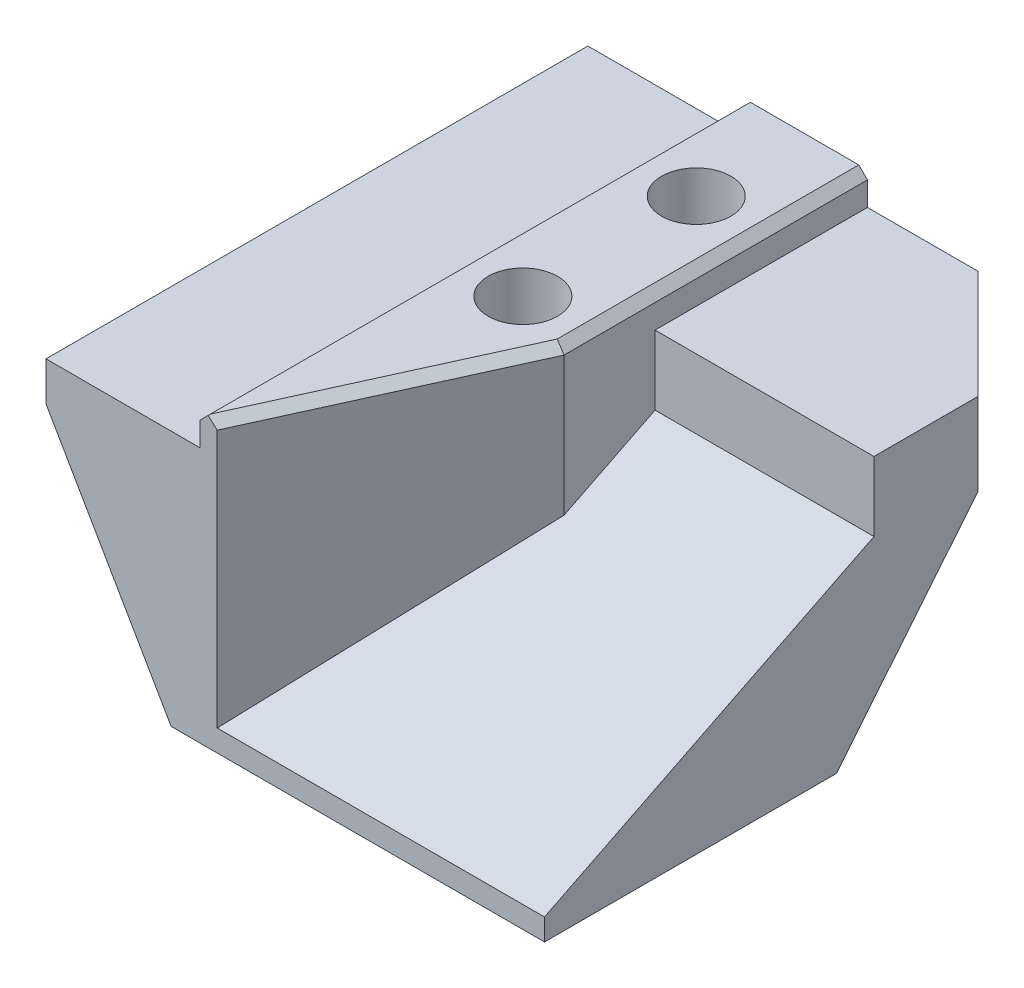
ISO-10303-21;
HEADER;
FILE_DESCRIPTION(('STEP AP214'),'2;1');
FILE_NAME('part.step','',(''),(''),'','','');
FILE_SCHEMA(('AUTOMOTIVE_DESIGN { 1 0 10303 214 1 1 1 1 }'));
ENDSEC;
DATA;
#1=APPLICATION_CONTEXT('core data for automotive mechanical design processes');
#2=APPLICATION_PROTOCOL_DEFINITION('international standard','automotive_design',2000,#1);
#3=PRODUCT_CONTEXT('',#1,'mechanical');
#4=PRODUCT('Part','Part','',(#3));
#5=PRODUCT_RELATED_PRODUCT_CATEGORY('part','',(#4));
#6=PRODUCT_DEFINITION_FORMATION('','',#4);
#7=PRODUCT_DEFINITION_CONTEXT('part definition',#1,'design');
#8=PRODUCT_DEFINITION('design','',#6,#7);
#9=PRODUCT_DEFINITION_SHAPE('','',#8);
#10=(LENGTH_UNIT() NAMED_UNIT(*) SI_UNIT(.MILLI.,.METRE.));
#11=(NAMED_UNIT(*) PLANE_ANGLE_UNIT() SI_UNIT($,.RADIAN.));
#12=(NAMED_UNIT(*) SI_UNIT($,.STERADIAN.) SOLID_ANGLE_UNIT());
#13=UNCERTAINTY_MEASURE_WITH_UNIT(LENGTH_MEASURE(1.E-05),#10,'distance_accuracy_value','');
#14=(GEOMETRIC_REPRESENTATION_CONTEXT(3) GLOBAL_UNCERTAINTY_ASSIGNED_CONTEXT((#13)) GLOBAL_UNIT_ASSIGNED_CONTEXT((#10,
#11,#12)) REPRESENTATION_CONTEXT('',''));
#15=CARTESIAN_POINT('',(0.,0.,0.));
#16=DIRECTION('',(0.,0.,1.));
#17=DIRECTION('',(1.,0.,0.));
#18=AXIS2_PLACEMENT_3D('',#15,#16,#17);
#19=CARTESIAN_POINT('',(12.9,7.8,20.));
#20=DIRECTION('',(-1.,0.,0.));
#21=DIRECTION('',(0.,0.,-1.));
#22=AXIS2_PLACEMENT_3D('',#19,#20,#21);
#23=PLANE('',#22);
#24=DIRECTION('',(0.,-1.,0.));
#25=VECTOR('',#24,1.);
#26=CARTESIAN_POINT('',(12.9,0.,9.8));
#27=LINE('',#26,#25);
#28=CARTESIAN_POINT('',(12.9,7.8,9.8));
#29=VERTEX_POINT('',#28);
#30=CARTESIAN_POINT('',(12.9,4.6,9.8));
#31=VERTEX_POINT('',#30);
#32=EDGE_CURVE('E171',#29,#31,#27,.T.);
#33=ORIENTED_EDGE('',*,*,#32,.F.);
#34=DIRECTION('',(0.,0.,-1.));
#35=VECTOR('',#34,1.);
#36=CARTESIAN_POINT('',(12.9,7.8,7.));
#37=LINE('',#36,#35);
#38=CARTESIAN_POINT('',(12.9,7.8,0.));
#39=VERTEX_POINT('',#38);
#40=EDGE_CURVE('E194',#29,#39,#37,.T.);
#41=ORIENTED_EDGE('',*,*,#40,.T.);
#42=DIRECTION('',(0.,-1.,0.));
#43=VECTOR('',#42,1.);
#44=CARTESIAN_POINT('',(12.9,7.8,0.));
#45=LINE('',#44,#43);
#46=CARTESIAN_POINT('',(12.9,8.9,0.));
#47=VERTEX_POINT('',#46);
#48=EDGE_CURVE('E252',#47,#39,#45,.T.);
#49=ORIENTED_EDGE('',*,*,#48,.F.);
#50=DIRECTION('',(0.,0.,-1.));
#51=VECTOR('',#50,1.);
#52=CARTESIAN_POINT('',(12.9,8.9,0.));
#53=LINE('',#52,#51);
#54=CARTESIAN_POINT('',(12.9,8.9,14.));
#55=VERTEX_POINT('',#54);
#56=EDGE_CURVE('E313',#55,#47,#53,.T.);
#57=ORIENTED_EDGE('',*,*,#56,.F.);
#58=DIRECTION('',(0.,1.,0.));
#59=VECTOR('',#58,1.);
#60=CARTESIAN_POINT('',(12.9,-13.0461510298504,14.));
#61=LINE('',#60,#59);
#62=CARTESIAN_POINT('',(12.9,2.5,14.));
#63=VERTEX_POINT('',#62);
#64=EDGE_CURVE('E179',#63,#55,#61,.T.);
#65=ORIENTED_EDGE('',*,*,#64,.F.);
#66=DIRECTION('',(0.,-0.447213595499958,0.894427190999916));
#67=VECTOR('',#66,1.);
#68=CARTESIAN_POINT('',(12.9,6.,7.));
#69=LINE('',#68,#67);
#70=EDGE_CURVE('E163',#31,#63,#69,.T.);
#71=ORIENTED_EDGE('',*,*,#70,.F.);
#72=EDGE_LOOP('',(#33,#41,#49,#57,#65,#71));
#73=FACE_BOUND('',#72,.T.);
#74=ADVANCED_FACE('F39',(#73),#23,.F.);
#75=CARTESIAN_POINT('',(-7.2246117974981,6.,7.));
#76=DIRECTION('',(0.,-0.894427190999916,-0.447213595499958));
#77=DIRECTION('',(0.,-0.447213595499958,0.894427190999916));
#78=AXIS2_PLACEMENT_3D('',#75,#76,#77);
#79=PLANE('',#78);
#80=DIRECTION('',(1.,0.,0.));
#81=VECTOR('',#80,1.);
#82=CARTESIAN_POINT('',(8.64794167490615,4.6,9.8));
#83=LINE('',#82,#81);
#84=CARTESIAN_POINT('',(23.,4.6,9.8));
#85=VERTEX_POINT('',#84);
#86=EDGE_CURVE('E159',#31,#85,#83,.T.);
#87=ORIENTED_EDGE('',*,*,#86,.F.);
#88=ORIENTED_EDGE('',*,*,#70,.T.);
#89=DIRECTION('',(0.376621788577355,0.41428396743509,-0.82856793487018));
#90=VECTOR('',#89,1.);
#91=CARTESIAN_POINT('',(10.4743594137822,-0.168204644839576,19.3364092896792));
#92=LINE('',#91,#90);
#93=CARTESIAN_POINT('',(7.9,-3.,25.));
#94=VERTEX_POINT('',#93);
#95=EDGE_CURVE('E200',#94,#63,#92,.T.);
#96=ORIENTED_EDGE('',*,*,#95,.F.);
#97=DIRECTION('',(1.,0.,0.));
#98=VECTOR('',#97,1.);
#99=CARTESIAN_POINT('',(-7.2246117974981,-3.,25.));
#100=LINE('',#99,#98);
#101=CARTESIAN_POINT('',(23.,-3.,25.));
#102=VERTEX_POINT('',#101);
#103=EDGE_CURVE('E180',#94,#102,#100,.T.);
#104=ORIENTED_EDGE('',*,*,#103,.T.);
#105=DIRECTION('',(0.,-0.447213595499958,0.894427190999916));
#106=VECTOR('',#105,1.);
#107=CARTESIAN_POINT('',(23.,6.,7.));
#108=LINE('',#107,#106);
#109=EDGE_CURVE('E167',#85,#102,#108,.T.);
#110=ORIENTED_EDGE('',*,*,#109,.F.);
#111=EDGE_LOOP('',(#87,#88,#96,#104,#110));
#112=FACE_BOUND('',#111,.T.);
#113=ADVANCED_FACE('F161',(#112),#79,.F.);
#114=CARTESIAN_POINT('',(10.,7.8,13.));
#115=DIRECTION('',(0.,-1.,0.));
#116=DIRECTION('',(0.,0.,1.));
#117=AXIS2_PLACEMENT_3D('',#114,#115,#116);
#118=CYLINDRICAL_SURFACE('',#117,1.6);
#119=CARTESIAN_POINT('',(10.,3.90000000000001,13.));
#120=DIRECTION('',(0.,1.,0.));
#121=DIRECTION('',(0.,0.,1.));
#122=AXIS2_PLACEMENT_3D('',#119,#120,#121);
#123=CIRCLE('',#122,1.6);
#124=CARTESIAN_POINT('',(10.,3.90000000000001,14.6));
#125=VERTEX_POINT('',#124);
#126=EDGE_CURVE('E284',#125,#125,#123,.T.);
#127=ORIENTED_EDGE('',*,*,#126,.F.);
#128=EDGE_LOOP('',(#127));
#129=FACE_BOUND('',#128,.T.);
#130=CARTESIAN_POINT('',(10.,9.3,13.));
#131=DIRECTION('',(0.,-1.,0.));
#132=DIRECTION('',(0.,0.,-1.));
#133=AXIS2_PLACEMENT_3D('',#130,#131,#132);
#134=CIRCLE('',#133,1.6);
#135=CARTESIAN_POINT('',(10.,9.3,11.4));
#136=VERTEX_POINT('',#135);
#137=EDGE_CURVE('E237',#136,#136,#134,.T.);
#138=ORIENTED_EDGE('',*,*,#137,.F.);
#139=EDGE_LOOP('',(#138));
#140=FACE_BOUND('',#139,.T.);
#141=ADVANCED_FACE('F371',(#129,#140),#118,.F.);
#142=CARTESIAN_POINT('',(10.,7.8,5.));
#143=DIRECTION('',(0.,-1.,0.));
#144=DIRECTION('',(0.,0.,1.));
#145=AXIS2_PLACEMENT_3D('',#142,#143,#144);
#146=CYLINDRICAL_SURFACE('',#145,1.6);
#147=CARTESIAN_POINT('',(10.,3.90000000000001,5.));
#148=DIRECTION('',(0.,1.,0.));
#149=DIRECTION('',(0.,0.,1.));
#150=AXIS2_PLACEMENT_3D('',#147,#148,#149);
#151=CIRCLE('',#150,1.6);
#152=CARTESIAN_POINT('',(10.,3.90000000000001,6.6));
#153=VERTEX_POINT('',#152);
#154=EDGE_CURVE('E287',#153,#153,#151,.T.);
#155=ORIENTED_EDGE('',*,*,#154,.F.);
#156=EDGE_LOOP('',(#155));
#157=FACE_BOUND('',#156,.T.);
#158=CARTESIAN_POINT('',(10.,9.3,5.));
#159=DIRECTION('',(0.,-1.,0.));
#160=DIRECTION('',(0.,0.,-1.));
#161=AXIS2_PLACEMENT_3D('',#158,#159,#160);
#162=CIRCLE('',#161,1.6);
#163=CARTESIAN_POINT('',(10.,9.3,3.4));
#164=VERTEX_POINT('',#163);
#165=EDGE_CURVE('E234',#164,#164,#162,.T.);
#166=ORIENTED_EDGE('',*,*,#165,.F.);
#167=EDGE_LOOP('',(#166));
#168=FACE_BOUND('',#167,.T.);
#169=ADVANCED_FACE('F380',(#157,#168),#146,.F.);
#170=CARTESIAN_POINT('',(0.,4.,0.));
#171=DIRECTION('',(1.,0.,0.));
#172=DIRECTION('',(0.,0.,1.));
#173=AXIS2_PLACEMENT_3D('',#170,#171,#172);
#174=PLANE('',#173);
#175=DIRECTION('',(0.,1.,0.));
#176=VECTOR('',#175,1.);
#177=CARTESIAN_POINT('',(0.,-4.,25.));
#178=LINE('',#177,#176);
#179=CARTESIAN_POINT('',(0.,6.00000000000006,25.));
#180=VERTEX_POINT('',#179);
#181=CARTESIAN_POINT('',(0.,7.8,25.));
#182=VERTEX_POINT('',#181);
#183=EDGE_CURVE('E214',#180,#182,#178,.T.);
#184=ORIENTED_EDGE('',*,*,#183,.T.);
#185=DIRECTION('',(0.,0.,-1.));
#186=VECTOR('',#185,1.);
#187=CARTESIAN_POINT('',(0.,7.8,20.));
#188=LINE('',#187,#186);
#189=CARTESIAN_POINT('',(0.,7.8,0.));
#190=VERTEX_POINT('',#189);
#191=EDGE_CURVE('E246',#182,#190,#188,.T.);
#192=ORIENTED_EDGE('',*,*,#191,.T.);
#193=DIRECTION('',(0.,-1.,0.));
#194=VECTOR('',#193,1.);
#195=CARTESIAN_POINT('',(0.,4.,0.));
#196=LINE('',#195,#194);
#197=CARTESIAN_POINT('',(0.,6.00000000000006,0.));
#198=VERTEX_POINT('',#197);
#199=EDGE_CURVE('E254',#190,#198,#196,.T.);
#200=ORIENTED_EDGE('',*,*,#199,.T.);
#201=DIRECTION('',(0.,0.,-1.));
#202=VECTOR('',#201,1.);
#203=CARTESIAN_POINT('',(0.,6.00000000000006,0.));
#204=LINE('',#203,#202);
#205=EDGE_CURVE('E262',#180,#198,#204,.T.);
#206=ORIENTED_EDGE('',*,*,#205,.F.);
#207=EDGE_LOOP('',(#184,#192,#200,#206));
#208=FACE_BOUND('',#207,.T.);
#209=ADVANCED_FACE('F342',(#208),#174,.F.);
#210=CARTESIAN_POINT('',(0.,4.,0.));
#211=DIRECTION('',(0.,0.,1.));
#212=DIRECTION('',(-1.,0.,0.));
#213=AXIS2_PLACEMENT_3D('',#210,#211,#212);
#214=PLANE('',#213);
#215=ORIENTED_EDGE('',*,*,#48,.T.);
#216=DIRECTION('',(1.,0.,0.));
#217=VECTOR('',#216,1.);
#218=CARTESIAN_POINT('',(12.9,7.8,0.));
#219=LINE('',#218,#217);
#220=CARTESIAN_POINT('',(18.,7.8,0.));
#221=VERTEX_POINT('',#220);
#222=EDGE_CURVE('E196',#39,#221,#219,.T.);
#223=ORIENTED_EDGE('',*,*,#222,.T.);
#224=DIRECTION('',(0.,1.,0.));
#225=VECTOR('',#224,1.);
#226=CARTESIAN_POINT('',(18.,6.,0.));
#227=LINE('',#226,#225);
#228=CARTESIAN_POINT('',(18.,4.00000000000006,0.));
#229=VERTEX_POINT('',#228);
#230=EDGE_CURVE('E271',#229,#221,#227,.T.);
#231=ORIENTED_EDGE('',*,*,#230,.F.);
#232=DIRECTION('',(-0.632455532033675,-0.774596669241484,0.));
#233=VECTOR('',#232,1.);
#234=CARTESIAN_POINT('',(9.17442188206252,-6.80908153700972,0.));
#235=LINE('',#234,#233);
#236=CARTESIAN_POINT('',(11.4680273525781,-4.,0.));
#237=VERTEX_POINT('',#236);
#238=EDGE_CURVE('E276',#237,#229,#235,.F.);
#239=ORIENTED_EDGE('',*,*,#238,.F.);
#240=DIRECTION('',(-1.,0.,0.));
#241=VECTOR('',#240,1.);
#242=CARTESIAN_POINT('',(23.,-4.,0.));
#243=LINE('',#242,#241);
#244=CARTESIAN_POINT('',(5.77350269189626,-4.,0.));
#245=VERTEX_POINT('',#244);
#246=EDGE_CURVE('E231',#237,#245,#243,.T.);
#247=ORIENTED_EDGE('',*,*,#246,.T.);
#248=DIRECTION('',(0.499999999999998,-0.86602540378444,0.));
#249=VECTOR('',#248,1.);
#250=CARTESIAN_POINT('',(5.77350269189626,-4.,0.));
#251=LINE('',#250,#249);
#252=EDGE_CURVE('E265',#198,#245,#251,.T.);
#253=ORIENTED_EDGE('',*,*,#252,.F.);
#254=ORIENTED_EDGE('',*,*,#199,.F.);
#255=DIRECTION('',(1.,0.,0.));
#256=VECTOR('',#255,1.);
#257=CARTESIAN_POINT('',(0.,7.8,0.));
#258=LINE('',#257,#256);
#259=CARTESIAN_POINT('',(7.1,7.8,0.));
#260=VERTEX_POINT('',#259);
#261=EDGE_CURVE('E249',#190,#260,#258,.T.);
#262=ORIENTED_EDGE('',*,*,#261,.T.);
#263=DIRECTION('',(0.,-1.,0.));
#264=VECTOR('',#263,1.);
#265=CARTESIAN_POINT('',(7.1,9.3,0.));
#266=LINE('',#265,#264);
#267=CARTESIAN_POINT('',(7.1,8.9,0.));
#268=VERTEX_POINT('',#267);
#269=EDGE_CURVE('E243',#268,#260,#266,.T.);
#270=ORIENTED_EDGE('',*,*,#269,.F.);
#271=DIRECTION('',(-0.707106781186548,-0.707106781186548,0.));
#272=VECTOR('',#271,1.);
#273=CARTESIAN_POINT('',(7.5,9.3,0.));
#274=LINE('',#273,#272);
#275=CARTESIAN_POINT('',(7.5,9.3,0.));
#276=VERTEX_POINT('',#275);
#277=EDGE_CURVE('E315',#276,#268,#274,.T.);
#278=ORIENTED_EDGE('',*,*,#277,.F.);
#279=DIRECTION('',(1.,0.,0.));
#280=VECTOR('',#279,1.);
#281=CARTESIAN_POINT('',(7.1,9.3,0.));
#282=LINE('',#281,#280);
#283=CARTESIAN_POINT('',(12.5,9.3,0.));
#284=VERTEX_POINT('',#283);
#285=EDGE_CURVE('E241',#276,#284,#282,.T.);
#286=ORIENTED_EDGE('',*,*,#285,.T.);
#287=DIRECTION('',(-0.707106781186548,0.707106781186548,0.));
#288=VECTOR('',#287,1.);
#289=CARTESIAN_POINT('',(12.5,9.3,0.));
#290=LINE('',#289,#288);
#291=EDGE_CURVE('E48',#47,#284,#290,.T.);
#292=ORIENTED_EDGE('',*,*,#291,.F.);
#293=EDGE_LOOP('',(#215,#223,#231,#239,#247,#253,#254,#262,#270,#278,#286,#292));
#294=FACE_BOUND('',#293,.T.);
#295=ADVANCED_FACE('F330',(#294),#214,.F.);
#296=CARTESIAN_POINT('',(0.,7.8,0.));
#297=DIRECTION('',(0.,1.,0.));
#298=DIRECTION('',(0.,0.,-1.));
#299=AXIS2_PLACEMENT_3D('',#296,#297,#298);
#300=PLANE('',#299);
#301=DIRECTION('',(0.,0.,-1.));
#302=VECTOR('',#301,1.);
#303=CARTESIAN_POINT('',(7.1,7.8,20.));
#304=LINE('',#303,#302);
#305=CARTESIAN_POINT('',(7.1,7.8,25.));
#306=VERTEX_POINT('',#305);
#307=EDGE_CURVE('E240',#306,#260,#304,.T.);
#308=ORIENTED_EDGE('',*,*,#307,.T.);
#309=ORIENTED_EDGE('',*,*,#261,.F.);
#310=ORIENTED_EDGE('',*,*,#191,.F.);
#311=DIRECTION('',(1.,0.,0.));
#312=VECTOR('',#311,1.);
#313=CARTESIAN_POINT('',(0.,7.8,25.));
#314=LINE('',#313,#312);
#315=EDGE_CURVE('E217',#182,#306,#314,.T.);
#316=ORIENTED_EDGE('',*,*,#315,.T.);
#317=EDGE_LOOP('',(#308,#309,#310,#316));
#318=FACE_BOUND('',#317,.T.);
#319=ADVANCED_FACE('F338',(#318),#300,.T.);
#320=CARTESIAN_POINT('',(0.,9.3,0.));
#321=DIRECTION('',(0.,1.,0.));
#322=DIRECTION('',(0.,0.,-1.));
#323=AXIS2_PLACEMENT_3D('',#320,#321,#322);
#324=PLANE('',#323);
#325=ORIENTED_EDGE('',*,*,#285,.F.);
#326=DIRECTION('',(0.,0.,-1.));
#327=VECTOR('',#326,1.);
#328=CARTESIAN_POINT('',(7.5,9.3,0.));
#329=LINE('',#328,#327);
#330=CARTESIAN_POINT('',(7.5,9.3,24.9133563221124));
#331=VERTEX_POINT('',#330);
#332=EDGE_CURVE('E299',#331,#276,#329,.T.);
#333=ORIENTED_EDGE('',*,*,#332,.F.);
#334=DIRECTION('',(-0.413802944301184,0.,0.910366477462605));
#335=VECTOR('',#334,1.);
#336=CARTESIAN_POINT('',(7.53585340901495,9.3,24.8344788222795));
#337=LINE('',#336,#335);
#338=CARTESIAN_POINT('',(12.5,9.3,13.9133563221124));
#339=VERTEX_POINT('',#338);
#340=EDGE_CURVE('E301',#339,#331,#337,.T.);
#341=ORIENTED_EDGE('',*,*,#340,.F.);
#342=DIRECTION('',(0.,0.,1.));
#343=VECTOR('',#342,1.);
#344=CARTESIAN_POINT('',(12.5,9.3,14.));
#345=LINE('',#344,#343);
#346=EDGE_CURVE('E304',#284,#339,#345,.T.);
#347=ORIENTED_EDGE('',*,*,#346,.F.);
#348=EDGE_LOOP('',(#325,#333,#341,#347));
#349=FACE_BOUND('',#348,.T.);
#350=ORIENTED_EDGE('',*,*,#137,.T.);
#351=EDGE_LOOP('',(#350));
#352=FACE_BOUND('',#351,.T.);
#353=ORIENTED_EDGE('',*,*,#165,.T.);
#354=EDGE_LOOP('',(#353));
#355=FACE_BOUND('',#354,.T.);
#356=ADVANCED_FACE('F326',(#349,#352,#355),#324,.T.);
#357=CARTESIAN_POINT('',(7.1,9.3,20.));
#358=DIRECTION('',(1.,0.,0.));
#359=DIRECTION('',(0.,0.,1.));
#360=AXIS2_PLACEMENT_3D('',#357,#358,#359);
#361=PLANE('',#360);
#362=ORIENTED_EDGE('',*,*,#269,.T.);
#363=ORIENTED_EDGE('',*,*,#307,.F.);
#364=DIRECTION('',(0.,1.,0.));
#365=VECTOR('',#364,1.);
#366=CARTESIAN_POINT('',(7.1,7.8,25.));
#367=LINE('',#366,#365);
#368=CARTESIAN_POINT('',(7.1,8.9,25.));
#369=VERTEX_POINT('',#368);
#370=EDGE_CURVE('E220',#306,#369,#367,.T.);
#371=ORIENTED_EDGE('',*,*,#370,.T.);
#372=DIRECTION('',(0.,0.,1.));
#373=VECTOR('',#372,1.);
#374=CARTESIAN_POINT('',(7.1,8.9,25.));
#375=LINE('',#374,#373);
#376=EDGE_CURVE('E11',#268,#369,#375,.T.);
#377=ORIENTED_EDGE('',*,*,#376,.F.);
#378=EDGE_LOOP('',(#362,#363,#371,#377));
#379=FACE_BOUND('',#378,.T.);
#380=ADVANCED_FACE('F332',(#379),#361,.F.);
#381=CARTESIAN_POINT('',(10.,2.4,5.));
#382=DIRECTION('',(0.,-1.,0.));
#383=DIRECTION('',(0.,0.,1.));
#384=AXIS2_PLACEMENT_3D('',#381,#382,#383);
#385=CYLINDRICAL_SURFACE('',#384,3.);
#386=CARTESIAN_POINT('',(10.,2.50000000000002,5.));
#387=DIRECTION('',(0.,1.,0.));
#388=DIRECTION('',(0.,0.,1.));
#389=AXIS2_PLACEMENT_3D('',#386,#387,#388);
#390=CIRCLE('',#389,3.);
#391=CARTESIAN_POINT('',(10.,2.50000000000002,8.));
#392=VERTEX_POINT('',#391);
#393=EDGE_CURVE('E293',#392,#392,#390,.F.);
#394=ORIENTED_EDGE('',*,*,#393,.F.);
#395=EDGE_LOOP('',(#394));
#396=FACE_BOUND('',#395,.T.);
#397=CARTESIAN_POINT('',(10.,-4.,5.));
#398=DIRECTION('',(0.,1.,0.));
#399=DIRECTION('',(0.,0.,1.));
#400=AXIS2_PLACEMENT_3D('',#397,#398,#399);
#401=CIRCLE('',#400,3.);
#402=CARTESIAN_POINT('',(10.,-4.,8.));
#403=VERTEX_POINT('',#402);
#404=EDGE_CURVE('E222',#403,#403,#401,.T.);
#405=ORIENTED_EDGE('',*,*,#404,.F.);
#406=EDGE_LOOP('',(#405));
#407=FACE_BOUND('',#406,.T.);
#408=ADVANCED_FACE('F403',(#396,#407),#385,.F.);
#409=CARTESIAN_POINT('',(10.,2.4,13.));
#410=DIRECTION('',(0.,-1.,0.));
#411=DIRECTION('',(0.,0.,1.));
#412=AXIS2_PLACEMENT_3D('',#409,#410,#411);
#413=CYLINDRICAL_SURFACE('',#412,3.);
#414=CARTESIAN_POINT('',(10.,2.50000000000002,13.));
#415=DIRECTION('',(0.,1.,0.));
#416=DIRECTION('',(0.,0.,1.));
#417=AXIS2_PLACEMENT_3D('',#414,#415,#416);
#418=CIRCLE('',#417,3.);
#419=CARTESIAN_POINT('',(10.,2.50000000000002,16.));
#420=VERTEX_POINT('',#419);
#421=EDGE_CURVE('E290',#420,#420,#418,.F.);
#422=ORIENTED_EDGE('',*,*,#421,.F.);
#423=EDGE_LOOP('',(#422));
#424=FACE_BOUND('',#423,.T.);
#425=CARTESIAN_POINT('',(10.,-4.,13.));
#426=DIRECTION('',(0.,1.,0.));
#427=DIRECTION('',(0.,0.,1.));
#428=AXIS2_PLACEMENT_3D('',#425,#426,#427);
#429=CIRCLE('',#428,3.);
#430=CARTESIAN_POINT('',(10.,-4.,16.));
#431=VERTEX_POINT('',#430);
#432=EDGE_CURVE('E225',#431,#431,#429,.T.);
#433=ORIENTED_EDGE('',*,*,#432,.F.);
#434=EDGE_LOOP('',(#433));
#435=FACE_BOUND('',#434,.T.);
#436=ADVANCED_FACE('F406',(#424,#435),#413,.F.);
#437=CARTESIAN_POINT('',(23.,0.,0.));
#438=DIRECTION('',(1.,0.,0.));
#439=DIRECTION('',(0.,0.,1.));
#440=AXIS2_PLACEMENT_3D('',#437,#438,#439);
#441=PLANE('',#440);
#442=ORIENTED_EDGE('',*,*,#109,.T.);
#443=DIRECTION('',(0.,-1.,0.));
#444=VECTOR('',#443,1.);
#445=CARTESIAN_POINT('',(23.,6.,25.));
#446=LINE('',#445,#444);
#447=CARTESIAN_POINT('',(23.,-4.,25.));
#448=VERTEX_POINT('',#447);
#449=EDGE_CURVE('E208',#102,#448,#446,.T.);
#450=ORIENTED_EDGE('',*,*,#449,.T.);
#451=DIRECTION('',(0.,0.,-1.));
#452=VECTOR('',#451,1.);
#453=CARTESIAN_POINT('',(23.,-4.,20.));
#454=LINE('',#453,#452);
#455=CARTESIAN_POINT('',(23.,-4.,11.5319726474218));
#456=VERTEX_POINT('',#455);
#457=EDGE_CURVE('E228',#448,#456,#454,.T.);
#458=ORIENTED_EDGE('',*,*,#457,.T.);
#459=DIRECTION('',(0.,0.774596669241486,-0.632455532033673));
#460=VECTOR('',#459,1.);
#461=CARTESIAN_POINT('',(23.,4.04948974278318,4.95959179422659));
#462=LINE('',#461,#460);
#463=CARTESIAN_POINT('',(23.,4.00000000000006,5.));
#464=VERTEX_POINT('',#463);
#465=EDGE_CURVE('E281',#464,#456,#462,.F.);
#466=ORIENTED_EDGE('',*,*,#465,.F.);
#467=DIRECTION('',(0.,-1.,0.));
#468=VECTOR('',#467,1.);
#469=CARTESIAN_POINT('',(23.,-4.,5.));
#470=LINE('',#469,#468);
#471=CARTESIAN_POINT('',(23.,7.8,5.));
#472=VERTEX_POINT('',#471);
#473=EDGE_CURVE('E268',#472,#464,#470,.T.);
#474=ORIENTED_EDGE('',*,*,#473,.F.);
#475=DIRECTION('',(0.,0.,1.));
#476=VECTOR('',#475,1.);
#477=CARTESIAN_POINT('',(23.,7.8,5.));
#478=LINE('',#477,#476);
#479=CARTESIAN_POINT('',(23.,7.8,9.8));
#480=VERTEX_POINT('',#479);
#481=EDGE_CURVE('E187',#472,#480,#478,.T.);
#482=ORIENTED_EDGE('',*,*,#481,.T.);
#483=DIRECTION('',(0.,-1.,0.));
#484=VECTOR('',#483,1.);
#485=CARTESIAN_POINT('',(23.,0.,9.8));
#486=LINE('',#485,#484);
#487=EDGE_CURVE('E172',#480,#85,#486,.T.);
#488=ORIENTED_EDGE('',*,*,#487,.T.);
#489=EDGE_LOOP('',(#442,#450,#458,#466,#474,#482,#488));
#490=FACE_BOUND('',#489,.T.);
#491=ADVANCED_FACE('F352',(#490),#441,.T.);
#492=CARTESIAN_POINT('',(0.,-4.,0.));
#493=DIRECTION('',(0.,-1.,0.));
#494=DIRECTION('',(0.,0.,1.));
#495=AXIS2_PLACEMENT_3D('',#492,#493,#494);
#496=PLANE('',#495);
#497=ORIENTED_EDGE('',*,*,#432,.T.);
#498=EDGE_LOOP('',(#497));
#499=FACE_BOUND('',#498,.T.);
#500=ORIENTED_EDGE('',*,*,#457,.F.);
#501=DIRECTION('',(-1.,0.,0.));
#502=VECTOR('',#501,1.);
#503=CARTESIAN_POINT('',(23.,-4.,25.));
#504=LINE('',#503,#502);
#505=CARTESIAN_POINT('',(5.77350269189626,-4.,25.));
#506=VERTEX_POINT('',#505);
#507=EDGE_CURVE('E211',#448,#506,#504,.T.);
#508=ORIENTED_EDGE('',*,*,#507,.T.);
#509=DIRECTION('',(0.,0.,1.));
#510=VECTOR('',#509,1.);
#511=CARTESIAN_POINT('',(5.77350269189626,-4.,25.));
#512=LINE('',#511,#510);
#513=EDGE_CURVE('E257',#245,#506,#512,.T.);
#514=ORIENTED_EDGE('',*,*,#513,.F.);
#515=ORIENTED_EDGE('',*,*,#246,.F.);
#516=DIRECTION('',(-0.707106781186549,0.,-0.707106781186546));
#517=VECTOR('',#516,1.);
#518=CARTESIAN_POINT('',(5.73401367628905,-4.,-5.73401367628907));
#519=LINE('',#518,#517);
#520=EDGE_CURVE('E274',#456,#237,#519,.T.);
#521=ORIENTED_EDGE('',*,*,#520,.F.);
#522=EDGE_LOOP('',(#500,#508,#514,#515,#521));
#523=FACE_BOUND('',#522,.T.);
#524=ORIENTED_EDGE('',*,*,#404,.T.);
#525=EDGE_LOOP('',(#524));
#526=FACE_BOUND('',#525,.T.);
#527=ADVANCED_FACE('F348',(#499,#523,#526),#496,.T.);
#528=CARTESIAN_POINT('',(0.,0.,25.));
#529=DIRECTION('',(0.,0.,1.));
#530=DIRECTION('',(-1.,0.,0.));
#531=AXIS2_PLACEMENT_3D('',#528,#529,#530);
#532=PLANE('',#531);
#533=DIRECTION('',(0.707106781186548,0.707106781186548,0.));
#534=VECTOR('',#533,1.);
#535=CARTESIAN_POINT('',(-0.899999999999999,0.899999999999999,25.));
#536=LINE('',#535,#534);
#537=CARTESIAN_POINT('',(7.48123218270529,9.28123218270528,25.));
#538=VERTEX_POINT('',#537);
#539=EDGE_CURVE('E307',#369,#538,#536,.T.);
#540=ORIENTED_EDGE('',*,*,#539,.F.);
#541=ORIENTED_EDGE('',*,*,#370,.F.);
#542=ORIENTED_EDGE('',*,*,#315,.F.);
#543=ORIENTED_EDGE('',*,*,#183,.F.);
#544=DIRECTION('',(-0.499999999999998,0.86602540378444,0.));
#545=VECTOR('',#544,1.);
#546=CARTESIAN_POINT('',(2.59807621135334,1.5,25.));
#547=LINE('',#546,#545);
#548=EDGE_CURVE('E260',#506,#180,#547,.T.);
#549=ORIENTED_EDGE('',*,*,#548,.F.);
#550=ORIENTED_EDGE('',*,*,#507,.F.);
#551=ORIENTED_EDGE('',*,*,#449,.F.);
#552=ORIENTED_EDGE('',*,*,#103,.F.);
#553=DIRECTION('',(0.,1.,0.));
#554=VECTOR('',#553,1.);
#555=CARTESIAN_POINT('',(7.9,-13.0461510298504,25.));
#556=LINE('',#555,#554);
#557=CARTESIAN_POINT('',(7.9,8.9,25.));
#558=VERTEX_POINT('',#557);
#559=EDGE_CURVE('E202',#94,#558,#556,.T.);
#560=ORIENTED_EDGE('',*,*,#559,.T.);
#561=DIRECTION('',(0.739470404682127,-0.673189067498315,0.));
#562=VECTOR('',#561,1.);
#563=CARTESIAN_POINT('',(8.01060000305209,8.79931346481411,25.));
#564=LINE('',#563,#562);
#565=EDGE_CURVE('E310',#538,#558,#564,.T.);
#566=ORIENTED_EDGE('',*,*,#565,.F.);
#567=EDGE_LOOP('',(#540,#541,#542,#543,#549,#550,#551,#552,#560,#566));
#568=FACE_BOUND('',#567,.T.);
#569=ADVANCED_FACE('F334',(#568),#532,.T.);
#570=CARTESIAN_POINT('',(5.77350269189626,-4.,0.));
#571=DIRECTION('',(-0.86602540378444,-0.499999999999998,0.));
#572=DIRECTION('',(0.,0.,-1.));
#573=AXIS2_PLACEMENT_3D('',#570,#571,#572);
#574=PLANE('',#573);
#575=ORIENTED_EDGE('',*,*,#252,.T.);
#576=ORIENTED_EDGE('',*,*,#513,.T.);
#577=ORIENTED_EDGE('',*,*,#548,.T.);
#578=ORIENTED_EDGE('',*,*,#205,.T.);
#579=EDGE_LOOP('',(#575,#576,#577,#578));
#580=FACE_BOUND('',#579,.T.);
#581=ADVANCED_FACE('F345',(#580),#574,.T.);
#582=CARTESIAN_POINT('',(23.,0.,5.));
#583=DIRECTION('',(0.707106781186546,0.,-0.707106781186549));
#584=DIRECTION('',(0.,1.,0.));
#585=AXIS2_PLACEMENT_3D('',#582,#583,#584);
#586=PLANE('',#585);
#587=ORIENTED_EDGE('',*,*,#230,.T.);
#588=DIRECTION('',(0.707106781186549,0.,0.707106781186546));
#589=VECTOR('',#588,1.);
#590=CARTESIAN_POINT('',(18.,7.8,0.));
#591=LINE('',#590,#589);
#592=EDGE_CURVE('E185',#221,#472,#591,.T.);
#593=ORIENTED_EDGE('',*,*,#592,.T.);
#594=ORIENTED_EDGE('',*,*,#473,.T.);
#595=DIRECTION('',(0.707106781186549,0.,0.707106781186546));
#596=VECTOR('',#595,1.);
#597=CARTESIAN_POINT('',(23.,4.00000000000006,5.));
#598=LINE('',#597,#596);
#599=EDGE_CURVE('E279',#229,#464,#598,.T.);
#600=ORIENTED_EDGE('',*,*,#599,.F.);
#601=EDGE_LOOP('',(#587,#593,#594,#600));
#602=FACE_BOUND('',#601,.T.);
#603=ADVANCED_FACE('F383',(#602),#586,.T.);
#604=CARTESIAN_POINT('',(5.73401367628905,-4.,-5.73401367628907));
#605=DIRECTION('',(-0.612372435695794,0.499999999999998,0.612372435695797));
#606=DIRECTION('',(-0.707106781186549,0.,-0.707106781186546));
#607=AXIS2_PLACEMENT_3D('',#604,#605,#606);
#608=PLANE('',#607);
#609=ORIENTED_EDGE('',*,*,#465,.T.);
#610=ORIENTED_EDGE('',*,*,#520,.T.);
#611=ORIENTED_EDGE('',*,*,#238,.T.);
#612=ORIENTED_EDGE('',*,*,#599,.T.);
#613=EDGE_LOOP('',(#609,#610,#611,#612));
#614=FACE_BOUND('',#613,.T.);
#615=ADVANCED_FACE('F386',(#614),#608,.F.);
#616=CARTESIAN_POINT('',(12.9,-13.0461510298504,14.));
#617=DIRECTION('',(-0.910366477462605,0.,-0.413802944301184));
#618=DIRECTION('',(0.413802944301184,0.,-0.910366477462605));
#619=AXIS2_PLACEMENT_3D('',#616,#617,#618);
#620=PLANE('',#619);
#621=ORIENTED_EDGE('',*,*,#559,.F.);
#622=ORIENTED_EDGE('',*,*,#95,.T.);
#623=ORIENTED_EDGE('',*,*,#64,.T.);
#624=DIRECTION('',(0.413802944301184,0.,-0.910366477462605));
#625=VECTOR('',#624,1.);
#626=CARTESIAN_POINT('',(12.9,8.9,14.));
#627=LINE('',#626,#625);
#628=EDGE_CURVE('E296',#558,#55,#627,.T.);
#629=ORIENTED_EDGE('',*,*,#628,.F.);
#630=EDGE_LOOP('',(#621,#622,#623,#629));
#631=FACE_BOUND('',#630,.T.);
#632=ADVANCED_FACE('F355',(#631),#620,.F.);
#633=CARTESIAN_POINT('',(10.,2.4,13.));
#634=DIRECTION('',(0.,-1.,0.));
#635=DIRECTION('',(0.,0.,1.));
#636=AXIS2_PLACEMENT_3D('',#633,#634,#635);
#637=CONICAL_SURFACE('',#636,3.10000000000003,0.785398163397453);
#638=ORIENTED_EDGE('',*,*,#126,.T.);
#639=EDGE_LOOP('',(#638));
#640=FACE_BOUND('',#639,.T.);
#641=ORIENTED_EDGE('',*,*,#421,.T.);
#642=EDGE_LOOP('',(#641));
#643=FACE_BOUND('',#642,.T.);
#644=ADVANCED_FACE('F391',(#640,#643),#637,.F.);
#645=CARTESIAN_POINT('',(10.,2.4,5.));
#646=DIRECTION('',(0.,-1.,0.));
#647=DIRECTION('',(0.,0.,1.));
#648=AXIS2_PLACEMENT_3D('',#645,#646,#647);
#649=CONICAL_SURFACE('',#648,3.10000000000003,0.785398163397453);
#650=ORIENTED_EDGE('',*,*,#154,.T.);
#651=EDGE_LOOP('',(#650));
#652=FACE_BOUND('',#651,.T.);
#653=ORIENTED_EDGE('',*,*,#393,.T.);
#654=EDGE_LOOP('',(#653));
#655=FACE_BOUND('',#654,.T.);
#656=ADVANCED_FACE('F365',(#652,#655),#649,.F.);
#657=CARTESIAN_POINT('',(7.5,9.3,0.));
#658=DIRECTION('',(-0.707106781186547,0.707106781186547,0.));
#659=DIRECTION('',(0.,0.,1.));
#660=AXIS2_PLACEMENT_3D('',#657,#658,#659);
#661=PLANE('',#660);
#662=ORIENTED_EDGE('',*,*,#277,.T.);
#663=ORIENTED_EDGE('',*,*,#376,.T.);
#664=ORIENTED_EDGE('',*,*,#539,.T.);
#665=DIRECTION('',(-0.207109570842063,-0.207109570842063,0.956143949063755));
#666=VECTOR('',#665,1.);
#667=CARTESIAN_POINT('',(12.433506324112,14.233506324112,2.13728566401314));
#668=LINE('',#667,#666);
#669=EDGE_CURVE('E43',#538,#331,#668,.F.);
#670=ORIENTED_EDGE('',*,*,#669,.T.);
#671=ORIENTED_EDGE('',*,*,#332,.T.);
#672=EDGE_LOOP('',(#662,#663,#664,#670,#671));
#673=FACE_BOUND('',#672,.T.);
#674=ADVANCED_FACE('F41',(#673),#661,.T.);
#675=CARTESIAN_POINT('',(12.5,9.3,0.));
#676=DIRECTION('',(0.707106781186547,0.707106781186547,0.));
#677=DIRECTION('',(0.,0.,-1.));
#678=AXIS2_PLACEMENT_3D('',#675,#676,#677);
#679=PLANE('',#678);
#680=ORIENTED_EDGE('',*,*,#291,.T.);
#681=ORIENTED_EDGE('',*,*,#346,.T.);
#682=DIRECTION('',(-0.698955640180202,0.698955640180202,-0.151400218363677));
#683=VECTOR('',#682,1.);
#684=CARTESIAN_POINT('',(11.0276602987509,10.7723397012491,13.5944340050722));
#685=LINE('',#684,#683);
#686=EDGE_CURVE('E199',#339,#55,#685,.F.);
#687=ORIENTED_EDGE('',*,*,#686,.T.);
#688=ORIENTED_EDGE('',*,*,#56,.T.);
#689=EDGE_LOOP('',(#680,#681,#687,#688));
#690=FACE_BOUND('',#689,.T.);
#691=ADVANCED_FACE('F357',(#690),#679,.T.);
#692=CARTESIAN_POINT('',(12.9,8.9,14.));
#693=DIRECTION('',(0.643726309578718,0.707106781186547,0.292602867990326));
#694=DIRECTION('',(-0.413802944301184,0.,0.910366477462605));
#695=AXIS2_PLACEMENT_3D('',#692,#693,#694);
#696=PLANE('',#695);
#697=ORIENTED_EDGE('',*,*,#669,.F.);
#698=ORIENTED_EDGE('',*,*,#565,.T.);
#699=ORIENTED_EDGE('',*,*,#628,.T.);
#700=ORIENTED_EDGE('',*,*,#686,.F.);
#701=ORIENTED_EDGE('',*,*,#340,.T.);
#702=EDGE_LOOP('',(#697,#698,#699,#700,#701));
#703=FACE_BOUND('',#702,.T.);
#704=ADVANCED_FACE('F324',(#703),#696,.T.);
#705=CARTESIAN_POINT('',(0.,7.8,0.));
#706=DIRECTION('',(0.,1.,0.));
#707=DIRECTION('',(0.,0.,-1.));
#708=AXIS2_PLACEMENT_3D('',#705,#706,#707);
#709=PLANE('',#708);
#710=ORIENTED_EDGE('',*,*,#592,.F.);
#711=ORIENTED_EDGE('',*,*,#222,.F.);
#712=ORIENTED_EDGE('',*,*,#40,.F.);
#713=DIRECTION('',(1.,0.,0.));
#714=VECTOR('',#713,1.);
#715=CARTESIAN_POINT('',(8.64794167490615,7.8,9.8));
#716=LINE('',#715,#714);
#717=EDGE_CURVE('E183',#29,#480,#716,.T.);
#718=ORIENTED_EDGE('',*,*,#717,.T.);
#719=ORIENTED_EDGE('',*,*,#481,.F.);
#720=EDGE_LOOP('',(#710,#711,#712,#718,#719));
#721=FACE_BOUND('',#720,.T.);
#722=ADVANCED_FACE('F363',(#721),#709,.T.);
#723=CARTESIAN_POINT('',(8.64794167490615,0.,9.8));
#724=DIRECTION('',(0.,0.,-1.));
#725=DIRECTION('',(1.,0.,0.));
#726=AXIS2_PLACEMENT_3D('',#723,#724,#725);
#727=PLANE('',#726);
#728=ORIENTED_EDGE('',*,*,#32,.T.);
#729=ORIENTED_EDGE('',*,*,#86,.T.);
#730=ORIENTED_EDGE('',*,*,#487,.F.);
#731=ORIENTED_EDGE('',*,*,#717,.F.);
#732=EDGE_LOOP('',(#728,#729,#730,#731));
#733=FACE_BOUND('',#732,.T.);
#734=ADVANCED_FACE('F182',(#733),#727,.F.);
#735=CLOSED_SHELL('',(#74,#113,#141,#169,#209,#295,#319,#356,#380,#408,#436,#491,#527,#569,#581,
#603,#615,#632,#644,#656,#674,#691,#704,#722,#734));
#736=MANIFOLD_SOLID_BREP('B2',#735);
#737=ADVANCED_BREP_SHAPE_REPRESENTATION('',(#18,#736),#14);
#738=SHAPE_DEFINITION_REPRESENTATION(#9,#737);
ENDSEC;
END-ISO-10303-21;
